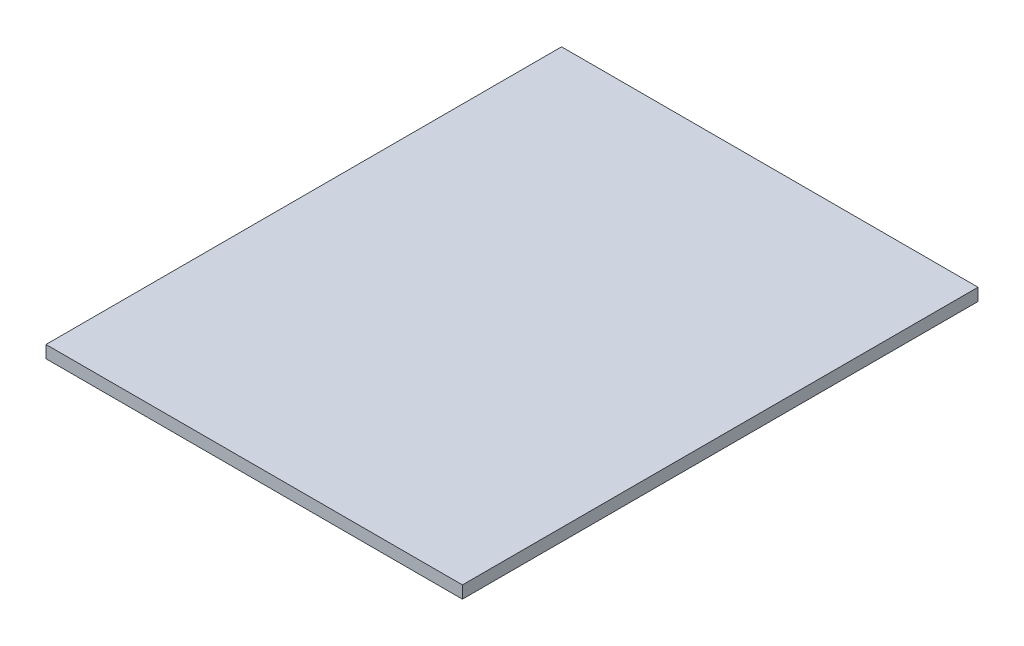
ISO-10303-21;
HEADER;
FILE_DESCRIPTION(('STEP AP214'),'2;1');
FILE_NAME('part.step','',(''),(''),'','','');
FILE_SCHEMA(('AUTOMOTIVE_DESIGN { 1 0 10303 214 1 1 1 1 }'));
ENDSEC;
DATA;
#1=APPLICATION_CONTEXT('core data for automotive mechanical design processes');
#2=APPLICATION_PROTOCOL_DEFINITION('international standard','automotive_design',2000,#1);
#3=PRODUCT_CONTEXT('',#1,'mechanical');
#4=PRODUCT('Part','Part','',(#3));
#5=PRODUCT_RELATED_PRODUCT_CATEGORY('part','',(#4));
#6=PRODUCT_DEFINITION_FORMATION('','',#4);
#7=PRODUCT_DEFINITION_CONTEXT('part definition',#1,'design');
#8=PRODUCT_DEFINITION('design','',#6,#7);
#9=PRODUCT_DEFINITION_SHAPE('','',#8);
#10=(LENGTH_UNIT() NAMED_UNIT(*) SI_UNIT(.MILLI.,.METRE.));
#11=(NAMED_UNIT(*) PLANE_ANGLE_UNIT() SI_UNIT($,.RADIAN.));
#12=(NAMED_UNIT(*) SI_UNIT($,.STERADIAN.) SOLID_ANGLE_UNIT());
#13=UNCERTAINTY_MEASURE_WITH_UNIT(LENGTH_MEASURE(1.E-05),#10,'distance_accuracy_value','');
#14=(GEOMETRIC_REPRESENTATION_CONTEXT(3) GLOBAL_UNCERTAINTY_ASSIGNED_CONTEXT((#13)) GLOBAL_UNIT_ASSIGNED_CONTEXT((#10,
#11,#12)) REPRESENTATION_CONTEXT('',''));
#15=CARTESIAN_POINT('',(0.,0.,0.));
#16=DIRECTION('',(0.,0.,1.));
#17=DIRECTION('',(1.,0.,0.));
#18=AXIS2_PLACEMENT_3D('',#15,#16,#17);
#19=CARTESIAN_POINT('',(0.,0.625,0.));
#20=DIRECTION('',(1.,0.,0.));
#21=DIRECTION('',(0.,0.,-1.));
#22=AXIS2_PLACEMENT_3D('',#19,#20,#21);
#23=PLANE('',#22);
#24=DIRECTION('',(0.,0.,1.));
#25=VECTOR('',#24,1.);
#26=CARTESIAN_POINT('',(0.,0.,0.));
#27=LINE('',#26,#25);
#28=CARTESIAN_POINT('',(0.,0.,-26.));
#29=VERTEX_POINT('',#28);
#30=CARTESIAN_POINT('',(0.,0.,0.));
#31=VERTEX_POINT('',#30);
#32=EDGE_CURVE('E107',#29,#31,#27,.T.);
#33=ORIENTED_EDGE('',*,*,#32,.T.);
#34=DIRECTION('',(0.,-1.,0.));
#35=VECTOR('',#34,1.);
#36=CARTESIAN_POINT('',(0.,0.625,0.));
#37=LINE('',#36,#35);
#38=CARTESIAN_POINT('',(0.,0.625,0.));
#39=VERTEX_POINT('',#38);
#40=EDGE_CURVE('E11',#39,#31,#37,.T.);
#41=ORIENTED_EDGE('',*,*,#40,.F.);
#42=DIRECTION('',(0.,0.,1.));
#43=VECTOR('',#42,1.);
#44=CARTESIAN_POINT('',(0.,0.625,0.));
#45=LINE('',#44,#43);
#46=CARTESIAN_POINT('',(0.,0.625,-26.));
#47=VERTEX_POINT('',#46);
#48=EDGE_CURVE('E91',#47,#39,#45,.T.);
#49=ORIENTED_EDGE('',*,*,#48,.F.);
#50=DIRECTION('',(0.,-1.,0.));
#51=VECTOR('',#50,1.);
#52=CARTESIAN_POINT('',(0.,0.625,-26.));
#53=LINE('',#52,#51);
#54=EDGE_CURVE('E103',#47,#29,#53,.T.);
#55=ORIENTED_EDGE('',*,*,#54,.T.);
#56=EDGE_LOOP('',(#33,#41,#49,#55));
#57=FACE_BOUND('',#56,.T.);
#58=ADVANCED_FACE('F39',(#57),#23,.F.);
#59=CARTESIAN_POINT('',(0.,0.625,0.));
#60=DIRECTION('',(0.,0.,-1.));
#61=DIRECTION('',(-1.,0.,0.));
#62=AXIS2_PLACEMENT_3D('',#59,#60,#61);
#63=PLANE('',#62);
#64=DIRECTION('',(1.,0.,0.));
#65=VECTOR('',#64,1.);
#66=CARTESIAN_POINT('',(0.,0.,0.));
#67=LINE('',#66,#65);
#68=CARTESIAN_POINT('',(21.,0.,0.));
#69=VERTEX_POINT('',#68);
#70=EDGE_CURVE('E96',#31,#69,#67,.T.);
#71=ORIENTED_EDGE('',*,*,#70,.T.);
#72=DIRECTION('',(0.,-1.,0.));
#73=VECTOR('',#72,1.);
#74=CARTESIAN_POINT('',(21.,0.625,0.));
#75=LINE('',#74,#73);
#76=CARTESIAN_POINT('',(21.,0.625,0.));
#77=VERTEX_POINT('',#76);
#78=EDGE_CURVE('E48',#77,#69,#75,.T.);
#79=ORIENTED_EDGE('',*,*,#78,.F.);
#80=DIRECTION('',(1.,0.,0.));
#81=VECTOR('',#80,1.);
#82=CARTESIAN_POINT('',(0.,0.625,0.));
#83=LINE('',#82,#81);
#84=EDGE_CURVE('E86',#39,#77,#83,.T.);
#85=ORIENTED_EDGE('',*,*,#84,.F.);
#86=ORIENTED_EDGE('',*,*,#40,.T.);
#87=EDGE_LOOP('',(#71,#79,#85,#86));
#88=FACE_BOUND('',#87,.T.);
#89=ADVANCED_FACE('F95',(#88),#63,.F.);
#90=CARTESIAN_POINT('',(21.,0.625,0.));
#91=DIRECTION('',(-1.,0.,0.));
#92=DIRECTION('',(0.,0.,1.));
#93=AXIS2_PLACEMENT_3D('',#90,#91,#92);
#94=PLANE('',#93);
#95=DIRECTION('',(0.,0.,-1.));
#96=VECTOR('',#95,1.);
#97=CARTESIAN_POINT('',(21.,0.,0.));
#98=LINE('',#97,#96);
#99=CARTESIAN_POINT('',(21.,0.,-26.));
#100=VERTEX_POINT('',#99);
#101=EDGE_CURVE('E73',#69,#100,#98,.T.);
#102=ORIENTED_EDGE('',*,*,#101,.T.);
#103=DIRECTION('',(0.,-1.,0.));
#104=VECTOR('',#103,1.);
#105=CARTESIAN_POINT('',(21.,0.625,-26.));
#106=LINE('',#105,#104);
#107=CARTESIAN_POINT('',(21.,0.625,-26.));
#108=VERTEX_POINT('',#107);
#109=EDGE_CURVE('E98',#108,#100,#106,.T.);
#110=ORIENTED_EDGE('',*,*,#109,.F.);
#111=DIRECTION('',(0.,0.,-1.));
#112=VECTOR('',#111,1.);
#113=CARTESIAN_POINT('',(21.,0.625,0.));
#114=LINE('',#113,#112);
#115=EDGE_CURVE('E89',#77,#108,#114,.T.);
#116=ORIENTED_EDGE('',*,*,#115,.F.);
#117=ORIENTED_EDGE('',*,*,#78,.T.);
#118=EDGE_LOOP('',(#102,#110,#116,#117));
#119=FACE_BOUND('',#118,.T.);
#120=ADVANCED_FACE('F99',(#119),#94,.F.);
#121=CARTESIAN_POINT('',(0.,0.625,-26.));
#122=DIRECTION('',(0.,0.,1.));
#123=DIRECTION('',(1.,0.,0.));
#124=AXIS2_PLACEMENT_3D('',#121,#122,#123);
#125=PLANE('',#124);
#126=DIRECTION('',(-1.,0.,0.));
#127=VECTOR('',#126,1.);
#128=CARTESIAN_POINT('',(0.,0.,-26.));
#129=LINE('',#128,#127);
#130=EDGE_CURVE('E79',#100,#29,#129,.T.);
#131=ORIENTED_EDGE('',*,*,#130,.T.);
#132=ORIENTED_EDGE('',*,*,#54,.F.);
#133=DIRECTION('',(-1.,0.,0.));
#134=VECTOR('',#133,1.);
#135=CARTESIAN_POINT('',(0.,0.625,-26.));
#136=LINE('',#135,#134);
#137=EDGE_CURVE('E56',#108,#47,#136,.T.);
#138=ORIENTED_EDGE('',*,*,#137,.F.);
#139=ORIENTED_EDGE('',*,*,#109,.T.);
#140=EDGE_LOOP('',(#131,#132,#138,#139));
#141=FACE_BOUND('',#140,.T.);
#142=ADVANCED_FACE('F120',(#141),#125,.F.);
#143=CARTESIAN_POINT('',(0.,0.625,0.));
#144=DIRECTION('',(0.,-1.,0.));
#145=DIRECTION('',(0.,0.,-1.));
#146=AXIS2_PLACEMENT_3D('',#143,#144,#145);
#147=PLANE('',#146);
#148=ORIENTED_EDGE('',*,*,#48,.T.);
#149=ORIENTED_EDGE('',*,*,#84,.T.);
#150=ORIENTED_EDGE('',*,*,#115,.T.);
#151=ORIENTED_EDGE('',*,*,#137,.T.);
#152=EDGE_LOOP('',(#148,#149,#150,#151));
#153=FACE_BOUND('',#152,.T.);
#154=ADVANCED_FACE('F87',(#153),#147,.F.);
#155=CARTESIAN_POINT('',(0.,0.,0.));
#156=DIRECTION('',(0.,-1.,0.));
#157=DIRECTION('',(0.,0.,-1.));
#158=AXIS2_PLACEMENT_3D('',#155,#156,#157);
#159=PLANE('',#158);
#160=ORIENTED_EDGE('',*,*,#32,.F.);
#161=ORIENTED_EDGE('',*,*,#130,.F.);
#162=ORIENTED_EDGE('',*,*,#101,.F.);
#163=ORIENTED_EDGE('',*,*,#70,.F.);
#164=EDGE_LOOP('',(#160,#161,#162,#163));
#165=FACE_BOUND('',#164,.T.);
#166=ADVANCED_FACE('F123',(#165),#159,.T.);
#167=CLOSED_SHELL('',(#58,#89,#120,#142,#154,#166));
#168=MANIFOLD_SOLID_BREP('B2',#167);
#169=ADVANCED_BREP_SHAPE_REPRESENTATION('',(#18,#168),#14);
#170=SHAPE_DEFINITION_REPRESENTATION(#9,#169);
ENDSEC;
END-ISO-10303-21;
